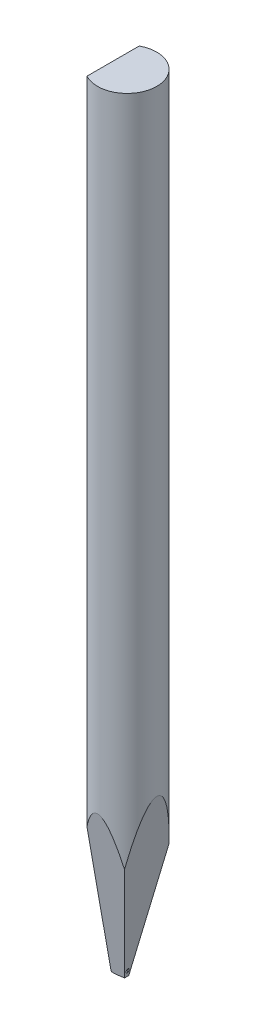
ISO-10303-21;
HEADER;
FILE_DESCRIPTION(('STEP AP214'),'2;1');
FILE_NAME('part.step','',(''),(''),'','','');
FILE_SCHEMA(('AUTOMOTIVE_DESIGN { 1 0 10303 214 1 1 1 1 }'));
ENDSEC;
DATA;
#1=APPLICATION_CONTEXT('core data for automotive mechanical design processes');
#2=APPLICATION_PROTOCOL_DEFINITION('international standard','automotive_design',2000,#1);
#3=PRODUCT_CONTEXT('',#1,'mechanical');
#4=PRODUCT('Part','Part','',(#3));
#5=PRODUCT_RELATED_PRODUCT_CATEGORY('part','',(#4));
#6=PRODUCT_DEFINITION_FORMATION('','',#4);
#7=PRODUCT_DEFINITION_CONTEXT('part definition',#1,'design');
#8=PRODUCT_DEFINITION('design','',#6,#7);
#9=PRODUCT_DEFINITION_SHAPE('','',#8);
#10=(LENGTH_UNIT() NAMED_UNIT(*) SI_UNIT(.MILLI.,.METRE.));
#11=(NAMED_UNIT(*) PLANE_ANGLE_UNIT() SI_UNIT($,.RADIAN.));
#12=(NAMED_UNIT(*) SI_UNIT($,.STERADIAN.) SOLID_ANGLE_UNIT());
#13=UNCERTAINTY_MEASURE_WITH_UNIT(LENGTH_MEASURE(1.E-05),#10,'distance_accuracy_value','');
#14=(GEOMETRIC_REPRESENTATION_CONTEXT(3) GLOBAL_UNCERTAINTY_ASSIGNED_CONTEXT((#13)) GLOBAL_UNIT_ASSIGNED_CONTEXT((#10,
#11,#12)) REPRESENTATION_CONTEXT('',''));
#15=CARTESIAN_POINT('',(0.,0.,0.));
#16=DIRECTION('',(0.,0.,1.));
#17=DIRECTION('',(1.,0.,0.));
#18=AXIS2_PLACEMENT_3D('',#15,#16,#17);
#19=CARTESIAN_POINT('',(26.8738719491216,0.,0.0508));
#20=DIRECTION('',(0.,-0.173648177666931,0.984807753012208));
#21=DIRECTION('',(0.,-0.984807753012208,-0.173648177666931));
#22=AXIS2_PLACEMENT_3D('',#19,#20,#21);
#23=PLANE('',#22);
#24=CARTESIAN_POINT('',(-0.35052,0.0254,0.0552787053099968));
#25=DIRECTION('',(0.,-0.173648177666931,0.984807753012208));
#26=DIRECTION('',(0.,-0.984807753012208,-0.173648177666931));
#27=AXIS2_PLACEMENT_3D('',#24,#25,#26);
#28=ELLIPSE('',#27,0.0257918359418979,0.0254);
#29=CARTESIAN_POINT('',(-0.35052,0.,0.0508000000000018));
#30=VERTEX_POINT('',#29);
#31=CARTESIAN_POINT('',(-0.37592,0.0254,0.0552787053099968));
#32=VERTEX_POINT('',#31);
#33=EDGE_CURVE('E204',#30,#32,#28,.F.);
#34=ORIENTED_EDGE('',*,*,#33,.F.);
#35=DIRECTION('',(-1.,0.,0.));
#36=VECTOR('',#35,1.);
#37=CARTESIAN_POINT('',(26.8738719491216,0.,0.0508));
#38=LINE('',#37,#36);
#39=CARTESIAN_POINT('',(-0.261619999999994,0.,0.0508000000000001));
#40=VERTEX_POINT('',#39);
#41=EDGE_CURVE('E268',#40,#30,#38,.T.);
#42=ORIENTED_EDGE('',*,*,#41,.F.);
#43=DIRECTION('',(-0.98997002855162,-0.139131214142995,-0.0245325869121374));
#44=VECTOR('',#43,1.);
#45=CARTESIAN_POINT('',(26.332265369517,3.73752684781165,0.709826824391458));
#46=LINE('',#45,#44);
#47=CARTESIAN_POINT('',(-0.0141883616704936,0.0347742489826101,0.0569316383295083));
#48=VERTEX_POINT('',#47);
#49=EDGE_CURVE('E265',#48,#40,#46,.T.);
#50=ORIENTED_EDGE('',*,*,#49,.F.);
#51=DIRECTION('',(-0.171087869746036,-0.970287525247814,-0.171087869746036));
#52=VECTOR('',#51,1.);
#53=CARTESIAN_POINT('',(0.766901483986011,4.46455489014234,0.838021483986016));
#54=LINE('',#53,#52);
#55=CARTESIAN_POINT('',(0.523678555180163,3.08516911589156,0.594798555180167));
#56=VERTEX_POINT('',#55);
#57=EDGE_CURVE('E262',#56,#48,#54,.T.);
#58=ORIENTED_EDGE('',*,*,#57,.F.);
#59=CARTESIAN_POINT('',(0.,-0.288101116436578,0.));
#60=DIRECTION('',(0.,-0.173648177666931,0.984807753012208));
#61=DIRECTION('',(0.,-0.984807753012208,-0.173648177666931));
#62=AXIS2_PLACEMENT_3D('',#59,#60,#61);
#63=ELLIPSE('',#62,4.56371043248163,0.792479999999998);
#64=CARTESIAN_POINT('',(-0.37592,3.66844093071415,0.69764511322018));
#65=VERTEX_POINT('',#64);
#66=EDGE_CURVE('E273',#56,#65,#63,.T.);
#67=ORIENTED_EDGE('',*,*,#66,.T.);
#68=DIRECTION('',(0.,0.984807753012208,0.173648177666931));
#69=VECTOR('',#68,1.);
#70=CARTESIAN_POINT('',(-0.37592,20.251112252608,3.62161747949059));
#71=LINE('',#70,#69);
#72=EDGE_CURVE('E287',#32,#65,#71,.T.);
#73=ORIENTED_EDGE('',*,*,#72,.F.);
#74=EDGE_LOOP('',(#34,#42,#50,#58,#67,#73));
#75=FACE_BOUND('',#74,.T.);
#76=ADVANCED_FACE('F46',(#75),#23,.T.);
#77=CARTESIAN_POINT('',(26.8738719491216,0.,-0.0508));
#78=DIRECTION('',(0.,-0.173648177666931,-0.984807753012208));
#79=DIRECTION('',(0.,0.984807753012208,-0.173648177666931));
#80=AXIS2_PLACEMENT_3D('',#77,#78,#79);
#81=PLANE('',#80);
#82=CARTESIAN_POINT('',(-0.35052,0.0254,-0.0552787053099968));
#83=DIRECTION('',(0.,-0.173648177666931,-0.984807753012208));
#84=DIRECTION('',(0.,0.984807753012208,-0.173648177666931));
#85=AXIS2_PLACEMENT_3D('',#82,#83,#84);
#86=ELLIPSE('',#85,0.0257918359418979,0.0254);
#87=CARTESIAN_POINT('',(-0.37592,0.0254,-0.0552787053099968));
#88=VERTEX_POINT('',#87);
#89=CARTESIAN_POINT('',(-0.35052,0.,-0.0508000000000018));
#90=VERTEX_POINT('',#89);
#91=EDGE_CURVE('E201',#88,#90,#86,.F.);
#92=ORIENTED_EDGE('',*,*,#91,.F.);
#93=DIRECTION('',(0.,-0.984807753012208,0.173648177666931));
#94=VECTOR('',#93,1.);
#95=CARTESIAN_POINT('',(-0.37592,20.5255765703836,-3.67001294395617));
#96=LINE('',#95,#94);
#97=CARTESIAN_POINT('',(-0.37592,3.66844093071414,-0.69764511322018));
#98=VERTEX_POINT('',#97);
#99=EDGE_CURVE('E193',#98,#88,#96,.T.);
#100=ORIENTED_EDGE('',*,*,#99,.F.);
#101=CARTESIAN_POINT('',(0.,-0.288101116436578,0.));
#102=DIRECTION('',(0.,-0.173648177666931,-0.984807753012208));
#103=DIRECTION('',(0.,-0.984807753012208,0.173648177666931));
#104=AXIS2_PLACEMENT_3D('',#101,#102,#103);
#105=ELLIPSE('',#104,4.56371043248163,0.792479999999998);
#106=CARTESIAN_POINT('',(0.523678555180163,3.08516911589156,-0.594798555180167));
#107=VERTEX_POINT('',#106);
#108=EDGE_CURVE('E276',#98,#107,#105,.T.);
#109=ORIENTED_EDGE('',*,*,#108,.T.);
#110=DIRECTION('',(0.171087869746036,0.970287525247814,-0.171087869746036));
#111=VECTOR('',#110,1.);
#112=CARTESIAN_POINT('',(0.766901483986011,4.46455489014234,-0.838021483986016));
#113=LINE('',#112,#111);
#114=CARTESIAN_POINT('',(-0.0141883616704936,0.0347742489826101,-0.0569316383295083));
#115=VERTEX_POINT('',#114);
#116=EDGE_CURVE('E290',#115,#107,#113,.T.);
#117=ORIENTED_EDGE('',*,*,#116,.F.);
#118=DIRECTION('',(0.98997002855162,0.139131214142995,-0.0245325869121374));
#119=VECTOR('',#118,1.);
#120=CARTESIAN_POINT('',(26.332265369517,3.73752684781165,-0.709826824391458));
#121=LINE('',#120,#119);
#122=CARTESIAN_POINT('',(-0.261619999999994,0.,-0.0508000000000001));
#123=VERTEX_POINT('',#122);
#124=EDGE_CURVE('E293',#123,#115,#121,.T.);
#125=ORIENTED_EDGE('',*,*,#124,.F.);
#126=DIRECTION('',(-1.,0.,0.));
#127=VECTOR('',#126,1.);
#128=CARTESIAN_POINT('',(26.8738719491216,0.,-0.0508));
#129=LINE('',#128,#127);
#130=EDGE_CURVE('E270',#123,#90,#129,.T.);
#131=ORIENTED_EDGE('',*,*,#130,.T.);
#132=EDGE_LOOP('',(#92,#100,#109,#117,#125,#131));
#133=FACE_BOUND('',#132,.T.);
#134=ADVANCED_FACE('F382',(#133),#81,.T.);
#135=CARTESIAN_POINT('',(-0.26162,0.,27.2760283406468));
#136=DIRECTION('',(-0.139173100960066,0.99026806874157,0.));
#137=DIRECTION('',(-0.99026806874157,-0.139173100960066,0.));
#138=AXIS2_PLACEMENT_3D('',#135,#136,#137);
#139=PLANE('',#138);
#140=DIRECTION('',(-0.99026806874157,-0.139173100960066,0.));
#141=VECTOR('',#140,1.);
#142=CARTESIAN_POINT('',(-0.26162,0.,0.0266699999999995));
#143=LINE('',#142,#141);
#144=CARTESIAN_POINT('',(-0.14478,0.0164207911266275,0.0266699999999997));
#145=VERTEX_POINT('',#144);
#146=CARTESIAN_POINT('',(-0.242759688637711,0.00265064390160265,0.02667));
#147=VERTEX_POINT('',#146);
#148=EDGE_CURVE('E248',#145,#147,#143,.T.);
#149=ORIENTED_EDGE('',*,*,#148,.F.);
#150=DIRECTION('',(0.,0.,1.));
#151=VECTOR('',#150,1.);
#152=CARTESIAN_POINT('',(-0.14478,0.0164207911266275,27.2760283406468));
#153=LINE('',#152,#151);
#154=CARTESIAN_POINT('',(-0.14478,0.0164207911266275,-0.0266699999999997));
#155=VERTEX_POINT('',#154);
#156=EDGE_CURVE('E304',#155,#145,#153,.T.);
#157=ORIENTED_EDGE('',*,*,#156,.F.);
#158=DIRECTION('',(-0.99026806874157,-0.139173100960066,0.));
#159=VECTOR('',#158,1.);
#160=CARTESIAN_POINT('',(-0.26162,0.,-0.0266699999999995));
#161=LINE('',#160,#159);
#162=CARTESIAN_POINT('',(-0.242759688637711,0.00265064390160265,-0.02667));
#163=VERTEX_POINT('',#162);
#164=EDGE_CURVE('E244',#155,#163,#161,.T.);
#165=ORIENTED_EDGE('',*,*,#164,.T.);
#166=CARTESIAN_POINT('',(-2.42134817183527,-0.30353,0.));
#167=DIRECTION('',(-0.139173100960066,0.99026806874157,0.));
#168=DIRECTION('',(-0.99026806874157,-0.139173100960066,0.));
#169=AXIS2_PLACEMENT_3D('',#166,#167,#168);
#170=ELLIPSE('',#169,2.20832903686027,0.30734);
#171=CARTESIAN_POINT('',(-0.26162,0.,-0.0482432865795794));
#172=VERTEX_POINT('',#171);
#173=EDGE_CURVE('E296',#163,#172,#170,.T.);
#174=ORIENTED_EDGE('',*,*,#173,.T.);
#175=DIRECTION('',(0.,0.,-1.));
#176=VECTOR('',#175,1.);
#177=CARTESIAN_POINT('',(-0.26162,0.,27.2760283406468));
#178=LINE('',#177,#176);
#179=EDGE_CURVE('E254',#172,#123,#178,.T.);
#180=ORIENTED_EDGE('',*,*,#179,.T.);
#181=ORIENTED_EDGE('',*,*,#124,.T.);
#182=DIRECTION('',(0.,0.,-1.));
#183=VECTOR('',#182,1.);
#184=CARTESIAN_POINT('',(-0.0141883616704921,0.0347742489826094,27.2760283406468));
#185=LINE('',#184,#183);
#186=EDGE_CURVE('E251',#48,#115,#185,.T.);
#187=ORIENTED_EDGE('',*,*,#186,.F.);
#188=ORIENTED_EDGE('',*,*,#49,.T.);
#189=CARTESIAN_POINT('',(-0.261619999999997,0.,0.0482432865795852));
#190=VERTEX_POINT('',#189);
#191=EDGE_CURVE('E256',#40,#190,#178,.T.);
#192=ORIENTED_EDGE('',*,*,#191,.T.);
#193=EDGE_CURVE('E297',#190,#147,#170,.T.);
#194=ORIENTED_EDGE('',*,*,#193,.T.);
#195=EDGE_LOOP('',(#149,#157,#165,#174,#180,#181,#187,#188,#192,#194));
#196=FACE_BOUND('',#195,.T.);
#197=ADVANCED_FACE('F329',(#196),#139,.F.);
#198=CARTESIAN_POINT('',(26.7309969491216,-0.30353,0.));
#199=DIRECTION('',(-1.,0.,0.));
#200=DIRECTION('',(0.,0.,1.));
#201=AXIS2_PLACEMENT_3D('',#198,#199,#200);
#202=CYLINDRICAL_SURFACE('',#201,0.30734);
#203=DIRECTION('',(-1.,0.,0.));
#204=VECTOR('',#203,1.);
#205=CARTESIAN_POINT('',(26.7309969491216,0.,0.0482432865795852));
#206=LINE('',#205,#204);
#207=CARTESIAN_POINT('',(-0.35052,0.,0.0482432865795858));
#208=VERTEX_POINT('',#207);
#209=EDGE_CURVE('E303',#190,#208,#206,.T.);
#210=ORIENTED_EDGE('',*,*,#209,.T.);
#211=CARTESIAN_POINT('',(-0.35052,0.,0.0482432865795852));
#212=CARTESIAN_POINT('',(-0.350767913301096,-1.19542843772803E-07,0.0482439866555444));
#213=CARTESIAN_POINT('',(-0.351014861392933,3.62470794984307E-06,0.0482204837583812));
#214=CARTESIAN_POINT('',(-0.351497824475882,1.77257610530701E-05,0.048131663550789));
#215=CARTESIAN_POINT('',(-0.351733938449228,2.79980345508259E-05,0.0480668807295799));
#216=CARTESIAN_POINT('',(-0.352256326088675,5.77005969758154E-05,0.0478789541586123));
#217=CARTESIAN_POINT('',(-0.352538394385228,7.88787351782238E-05,0.0477446199469163));
#218=CARTESIAN_POINT('',(-0.353078295346921,0.000127703558985932,0.0474331108524059));
#219=CARTESIAN_POINT('',(-0.353335984553503,0.000155385552449527,0.0472557019452807));
#220=CARTESIAN_POINT('',(-0.35400174233734,0.00023617459435752,0.0467343071530912));
#221=CARTESIAN_POINT('',(-0.354386489991853,0.000293366747035686,0.04636155839518));
#222=CARTESIAN_POINT('',(-0.355098951579075,0.000413574680164901,0.0455669319559007));
#223=CARTESIAN_POINT('',(-0.355426537167256,0.000476603091413842,0.0451449471799639));
#224=CARTESIAN_POINT('',(-0.356612086855196,0.000724574718518854,0.0434579803018295));
#225=CARTESIAN_POINT('',(-0.357318341338528,0.000917424822642028,0.0420900984298448));
#226=CARTESIAN_POINT('',(-0.358546499103955,0.00129385703696121,0.0392733364497388));
#227=CARTESIAN_POINT('',(-0.359067131306756,0.0014773681362723,0.0378239736931028));
#228=CARTESIAN_POINT('',(-0.361082963556255,0.00223677886764504,0.0314441024489423));
#229=CARTESIAN_POINT('',(-0.361998491462294,0.00272303861932352,0.0263250556700738));
#230=CARTESIAN_POINT('',(-0.363287466260708,0.00343648568054079,0.0160225561821279));
#231=CARTESIAN_POINT('',(-0.363659578270333,0.0036630347273081,0.0108389763129056));
#232=CARTESIAN_POINT('',(-0.363972985043323,0.00385330138614358,0.000449493392470492));
#233=CARTESIAN_POINT('',(-0.363914353724792,0.00381706409391508,-0.00475640567539981));
#234=CARTESIAN_POINT('',(-0.363359645903479,0.00348101396992523,-0.0151346555748545));
#235=CARTESIAN_POINT('',(-0.362863906204434,0.00318140407436096,-0.0203070291482792));
#236=CARTESIAN_POINT('',(-0.361587863461915,0.00253284401461739,-0.0281196828661227));
#237=CARTESIAN_POINT('',(-0.361052170464876,0.0022738659867185,-0.0308032472057407));
#238=CARTESIAN_POINT('',(-0.359879874536839,0.00178202258087802,-0.0352985409759539));
#239=CARTESIAN_POINT('',(-0.359320212463211,0.00156415994286779,-0.0371329765625637));
#240=CARTESIAN_POINT('',(-0.357915449615104,0.00108653420359569,-0.0408693960879428));
#241=CARTESIAN_POINT('',(-0.3570519058511,0.000824845821217691,-0.0427659366927652));
#242=CARTESIAN_POINT('',(-0.355666955135482,0.000526022910364276,-0.0448100132221557));
#243=CARTESIAN_POINT('',(-0.355427139387419,0.000477218188454204,-0.0451397061499097));
#244=CARTESIAN_POINT('',(-0.354916645564511,0.00038202095342617,-0.0457761949331125));
#245=CARTESIAN_POINT('',(-0.354645904201855,0.000335633680386315,-0.046082941629228));
#246=CARTESIAN_POINT('',(-0.354064289185953,0.000246758191854156,-0.046665244521223));
#247=CARTESIAN_POINT('',(-0.353752942125983,0.000204328109509145,-0.0469403464238046));
#248=CARTESIAN_POINT('',(-0.353086480397482,0.000127793869631165,-0.0474329155161114));
#249=CARTESIAN_POINT('',(-0.352731561443898,9.36543940562352E-05,-0.0476506275388426));
#250=CARTESIAN_POINT('',(-0.352132978988963,5.02841505678784E-05,-0.0479259603811109));
#251=CARTESIAN_POINT('',(-0.351903112512649,3.65754200289388E-05,-0.0480126464944021));
#252=CARTESIAN_POINT('',(-0.351432234922708,1.53075235908591E-05,-0.0481469291864184));
#253=CARTESIAN_POINT('',(-0.351191258260106,7.73054276230474E-06,-0.0481946390090931));
#254=CARTESIAN_POINT('',(-0.350805892270728,1.19685939597785E-06,-0.0482357533750439));
#255=CARTESIAN_POINT('',(-0.350662956582406,-3.31045745205668E-08,-0.0482434827775498));
#256=CARTESIAN_POINT('',(-0.35052,0.,-0.0482432865795856));
#257=B_SPLINE_CURVE_WITH_KNOTS('',3,(#211,#212,#213,#214,#215,#216,#217,#218,#219,#220,#221,
#222,#223,#224,#225,#226,#227,#228,#229,#230,#231,#232,#233,#234,#235,#236,#237,#238,#239,#240,
#241,#242,#243,#244,#245,#246,#247,#248,#249,#250,#251,#252,#253,#254,#255,#256),.UNSPECIFIED.,
.F.,.F.,(4,2,2,2,2,2,2,2,2,2,2,2,2,2,2,2,2,2,2,2,2,2,4),(0.,0.000741043318305486,
0.00147268140779397,0.00240682725086805,0.00334616655924916,0.00495326023235424,
0.00656391709747215,0.0111818210055972,0.0158307654682357,0.0313880221471822,0.0469834307890158,
0.0625761632290354,0.0781568915394422,0.0863865542979192,0.0921775559520869,0.0984081610414817,
0.0996385359491797,0.100871475463076,0.102120347956776,0.103363803055068,0.104099176293444,
0.104832405260387,0.105261095012052),.UNSPECIFIED.);
#258=CARTESIAN_POINT('',(-0.361394986445845,0.00245148621527582,0.028861259944239));
#259=VERTEX_POINT('',#258);
#260=EDGE_CURVE('E202',#208,#259,#257,.T.);
#261=ORIENTED_EDGE('',*,*,#260,.T.);
#262=CARTESIAN_POINT('',(-0.37592,0.,-0.0482432865795854));
#263=CARTESIAN_POINT('',(-0.363217772431748,0.00253447256157342,-0.0322972656685655));
#264=CARTESIAN_POINT('',(-0.35052,0.00380999999999999,-0.0161478491107738));
#265=CARTESIAN_POINT('',(-0.35052,0.00380999999999997,0.0161478491107741));
#266=CARTESIAN_POINT('',(-0.363217772431748,0.00253447256157349,0.0322972656685651));
#267=CARTESIAN_POINT('',(-0.37592,0.,0.0482432865795852));
#268=(BOUNDED_CURVE() B_SPLINE_CURVE(3,(#262,#263,#264,#265,#266,#267),.UNSPECIFIED.,.F.,
.F.) B_SPLINE_CURVE_WITH_KNOTS((4,2,4),(1.41317404265068,1.5707963267949,1.72841861093912),
.UNSPECIFIED.) CURVE() GEOMETRIC_REPRESENTATION_ITEM() RATIONAL_B_SPLINE_CURVE((1.,1.,1.,1.,1.,1.)) REPRESENTATION_ITEM(''));
#269=CARTESIAN_POINT('',(-0.36139493561956,0.00245148328491575,-0.0288612910505755));
#270=VERTEX_POINT('',#269);
#271=EDGE_CURVE('E185',#259,#270,#268,.F.);
#272=ORIENTED_EDGE('',*,*,#271,.T.);
#273=CARTESIAN_POINT('',(-0.35052,0.,-0.0482432865795858));
#274=VERTEX_POINT('',#273);
#275=EDGE_CURVE('E79',#270,#274,#257,.T.);
#276=ORIENTED_EDGE('',*,*,#275,.T.);
#277=DIRECTION('',(-1.,0.,0.));
#278=VECTOR('',#277,1.);
#279=CARTESIAN_POINT('',(26.7309969491216,0.,-0.0482432865795852));
#280=LINE('',#279,#278);
#281=EDGE_CURVE('E255',#172,#274,#280,.T.);
#282=ORIENTED_EDGE('',*,*,#281,.F.);
#283=ORIENTED_EDGE('',*,*,#173,.F.);
#284=DIRECTION('',(-1.,0.,0.));
#285=VECTOR('',#284,1.);
#286=CARTESIAN_POINT('',(26.7309969491216,0.00265064390160265,-0.02667));
#287=LINE('',#286,#285);
#288=CARTESIAN_POINT('',(-0.271948138549541,0.00265064390160211,-0.02667));
#289=VERTEX_POINT('',#288);
#290=EDGE_CURVE('E300',#163,#289,#287,.T.);
#291=ORIENTED_EDGE('',*,*,#290,.T.);
#292=CARTESIAN_POINT('',(-0.271948138551085,0.0026506439016026,0.02667));
#293=CARTESIAN_POINT('',(-0.279741629783165,0.00204900725860289,0.033576992678982));
#294=CARTESIAN_POINT('',(-0.291389606178554,0.00193660172033543,0.034257483360682));
#295=CARTESIAN_POINT('',(-0.311487532290503,0.00289784041037014,0.0241950109364427));
#296=CARTESIAN_POINT('',(-0.319710546582025,0.00381613135063559,0.0123603930079638));
#297=CARTESIAN_POINT('',(-0.319620360481282,0.003803793942765,-0.012663446302628));
#298=CARTESIAN_POINT('',(-0.311402735354475,0.00288674413616352,-0.0243323793322763));
#299=CARTESIAN_POINT('',(-0.291204635526973,0.0019239672897776,-0.0343680031120969));
#300=CARTESIAN_POINT('',(-0.279697672011876,0.00205131867932823,-0.0335504567852432));
#301=CARTESIAN_POINT('',(-0.271948138549539,0.00265064390160259,-0.02667));
#302=(BOUNDED_CURVE() B_SPLINE_CURVE(3,(#292,#293,#294,#295,#296,#297,#298,#299,#300,#301),
.UNSPECIFIED.,.F.,.F.) B_SPLINE_CURVE_WITH_KNOTS((4,2,2,2,4),(0.,2.31400024965948E-05,
4.62800049931879E-05,6.9420007489781E-05,9.25600099863741E-05),
.UNSPECIFIED.) CURVE() GEOMETRIC_REPRESENTATION_ITEM() RATIONAL_B_SPLINE_CURVE((1.,1.,1.,1.,1.,
1.,1.,1.,1.,1.)) REPRESENTATION_ITEM(''));
#303=CARTESIAN_POINT('',(-0.271948138549541,0.00265064390160196,0.02667));
#304=VERTEX_POINT('',#303);
#305=EDGE_CURVE('E306',#289,#304,#302,.F.);
#306=ORIENTED_EDGE('',*,*,#305,.T.);
#307=DIRECTION('',(-1.,0.,0.));
#308=VECTOR('',#307,1.);
#309=CARTESIAN_POINT('',(26.7309969491216,0.00265064390160265,0.02667));
#310=LINE('',#309,#308);
#311=EDGE_CURVE('E307',#147,#304,#310,.T.);
#312=ORIENTED_EDGE('',*,*,#311,.F.);
#313=ORIENTED_EDGE('',*,*,#193,.F.);
#314=EDGE_LOOP('',(#210,#261,#272,#276,#282,#283,#291,#306,#312,#313));
#315=FACE_BOUND('',#314,.T.);
#316=ADVANCED_FACE('F318',(#315),#202,.F.);
#317=CARTESIAN_POINT('',(0.,0.,0.));
#318=DIRECTION('',(0.,1.,0.));
#319=DIRECTION('',(0.,0.,1.));
#320=AXIS2_PLACEMENT_3D('',#317,#318,#319);
#321=PLANE('',#320);
#322=ORIENTED_EDGE('',*,*,#41,.T.);
#323=DIRECTION('',(0.,0.,-1.));
#324=VECTOR('',#323,1.);
#325=CARTESIAN_POINT('',(-0.35052,0.,26.4440181042188));
#326=LINE('',#325,#324);
#327=EDGE_CURVE('E71',#30,#208,#326,.T.);
#328=ORIENTED_EDGE('',*,*,#327,.T.);
#329=ORIENTED_EDGE('',*,*,#209,.F.);
#330=ORIENTED_EDGE('',*,*,#191,.F.);
#331=EDGE_LOOP('',(#322,#328,#329,#330));
#332=FACE_BOUND('',#331,.T.);
#333=ADVANCED_FACE('F328',(#332),#321,.F.);
#334=ORIENTED_EDGE('',*,*,#281,.T.);
#335=EDGE_CURVE('E200',#274,#90,#326,.T.);
#336=ORIENTED_EDGE('',*,*,#335,.T.);
#337=ORIENTED_EDGE('',*,*,#130,.F.);
#338=ORIENTED_EDGE('',*,*,#179,.F.);
#339=EDGE_LOOP('',(#334,#336,#337,#338));
#340=FACE_BOUND('',#339,.T.);
#341=ADVANCED_FACE('F387',(#340),#321,.F.);
#342=CARTESIAN_POINT('',(0.,21.0312,0.));
#343=DIRECTION('',(0.,-1.,0.));
#344=DIRECTION('',(0.,0.,-1.));
#345=AXIS2_PLACEMENT_3D('',#342,#343,#344);
#346=CYLINDRICAL_SURFACE('',#345,0.792479999999998);
#347=ORIENTED_EDGE('',*,*,#66,.F.);
#348=CARTESIAN_POINT('',(0.,0.115240446574634,0.));
#349=DIRECTION('',(-0.984807753012208,0.173648177666931,0.));
#350=DIRECTION('',(-0.173648177666931,-0.984807753012208,0.));
#351=AXIS2_PLACEMENT_3D('',#348,#349,#350);
#352=ELLIPSE('',#351,4.56371043248165,0.792479999999998);
#353=EDGE_CURVE('E259',#56,#107,#352,.T.);
#354=ORIENTED_EDGE('',*,*,#353,.T.);
#355=ORIENTED_EDGE('',*,*,#108,.F.);
#356=DIRECTION('',(0.,-1.,0.));
#357=VECTOR('',#356,1.);
#358=CARTESIAN_POINT('',(-0.37592,21.0312,-0.69764511322018));
#359=LINE('',#358,#357);
#360=CARTESIAN_POINT('',(-0.37592,21.0312,-0.69764511322018));
#361=VERTEX_POINT('',#360);
#362=EDGE_CURVE('E282',#361,#98,#359,.T.);
#363=ORIENTED_EDGE('',*,*,#362,.F.);
#364=CARTESIAN_POINT('',(0.,21.0312,0.));
#365=DIRECTION('',(0.,1.,0.));
#366=DIRECTION('',(0.,0.,1.));
#367=AXIS2_PLACEMENT_3D('',#364,#365,#366);
#368=CIRCLE('',#367,0.792479999999998);
#369=CARTESIAN_POINT('',(-0.37592,21.0312,0.69764511322018));
#370=VERTEX_POINT('',#369);
#371=EDGE_CURVE('E284',#370,#361,#368,.T.);
#372=ORIENTED_EDGE('',*,*,#371,.F.);
#373=DIRECTION('',(0.,-1.,0.));
#374=VECTOR('',#373,1.);
#375=CARTESIAN_POINT('',(-0.37592,21.0312,0.69764511322018));
#376=LINE('',#375,#374);
#377=EDGE_CURVE('E280',#65,#370,#376,.F.);
#378=ORIENTED_EDGE('',*,*,#377,.F.);
#379=EDGE_LOOP('',(#347,#354,#355,#363,#372,#378));
#380=FACE_BOUND('',#379,.T.);
#381=ADVANCED_FACE('F381',(#380),#346,.T.);
#382=CARTESIAN_POINT('',(-0.37592,21.0312,-0.80247998));
#383=DIRECTION('',(-1.,0.,0.));
#384=DIRECTION('',(0.,0.,1.));
#385=AXIS2_PLACEMENT_3D('',#382,#383,#384);
#386=PLANE('',#385);
#387=DIRECTION('',(0.,0.,-1.));
#388=VECTOR('',#387,1.);
#389=CARTESIAN_POINT('',(-0.37592,0.0254,26.4440181042188));
#390=LINE('',#389,#388);
#391=CARTESIAN_POINT('',(-0.37592,0.0253965728299479,0.0162828578856257));
#392=VERTEX_POINT('',#391);
#393=EDGE_CURVE('E196',#32,#392,#390,.T.);
#394=ORIENTED_EDGE('',*,*,#393,.F.);
#395=ORIENTED_EDGE('',*,*,#72,.T.);
#396=ORIENTED_EDGE('',*,*,#377,.T.);
#397=DIRECTION('',(0.,0.,-1.));
#398=VECTOR('',#397,1.);
#399=CARTESIAN_POINT('',(-0.37592,21.0312,-0.80247998));
#400=LINE('',#399,#398);
#401=EDGE_CURVE('E278',#370,#361,#400,.T.);
#402=ORIENTED_EDGE('',*,*,#401,.T.);
#403=ORIENTED_EDGE('',*,*,#362,.T.);
#404=ORIENTED_EDGE('',*,*,#99,.T.);
#405=CARTESIAN_POINT('',(-0.37592,0.0254,-0.0160570095759892));
#406=VERTEX_POINT('',#405);
#407=EDGE_CURVE('E190',#406,#88,#390,.T.);
#408=ORIENTED_EDGE('',*,*,#407,.F.);
#409=CARTESIAN_POINT('',(-0.37592,0.,0.0482432865795852));
#410=CARTESIAN_POINT('',(-0.37592,0.0149574693246277,0.0344039161936227));
#411=CARTESIAN_POINT('',(-0.37592,0.0292099999999983,0.0174815349681417));
#412=CARTESIAN_POINT('',(-0.37592,0.0292099999999983,-0.0174815349681413));
#413=CARTESIAN_POINT('',(-0.37592,0.0149574693246281,-0.0344039161936234));
#414=CARTESIAN_POINT('',(-0.37592,0.,-0.0482432865795854));
#415=(BOUNDED_CURVE() B_SPLINE_CURVE(3,(#409,#410,#411,#412,#413,#414),.UNSPECIFIED.,.F.,
.F.) B_SPLINE_CURVE_WITH_KNOTS((4,2,4),(1.41317404265068,1.5707963267949,1.72841861093912),
.UNSPECIFIED.) CURVE() GEOMETRIC_REPRESENTATION_ITEM() RATIONAL_B_SPLINE_CURVE((1.,1.,1.,1.,1.,1.)) REPRESENTATION_ITEM(''));
#416=EDGE_CURVE('E178',#406,#392,#415,.F.);
#417=ORIENTED_EDGE('',*,*,#416,.T.);
#418=EDGE_LOOP('',(#394,#395,#396,#402,#403,#404,#408,#417));
#419=FACE_BOUND('',#418,.T.);
#420=ADVANCED_FACE('F191',(#419),#386,.T.);
#421=CARTESIAN_POINT('',(0.,21.0312,0.));
#422=DIRECTION('',(0.,1.,0.));
#423=DIRECTION('',(0.,0.,1.));
#424=AXIS2_PLACEMENT_3D('',#421,#422,#423);
#425=PLANE('',#424);
#426=ORIENTED_EDGE('',*,*,#371,.T.);
#427=ORIENTED_EDGE('',*,*,#401,.F.);
#428=EDGE_LOOP('',(#426,#427));
#429=FACE_BOUND('',#428,.T.);
#430=ADVANCED_FACE('F380',(#429),#425,.T.);
#431=CARTESIAN_POINT('',(-0.0141883616704921,0.0347742489826094,27.2760283406468));
#432=DIRECTION('',(-0.984807753012208,0.173648177666931,0.));
#433=DIRECTION('',(-0.173648177666931,-0.984807753012208,0.));
#434=AXIS2_PLACEMENT_3D('',#431,#432,#433);
#435=PLANE('',#434);
#436=CARTESIAN_POINT('',(0.0121647761412605,0.184230320344282,0.));
#437=DIRECTION('',(-0.984807753012208,0.173648177666931,0.));
#438=DIRECTION('',(0.173648177666931,0.984807753012208,0.));
#439=AXIS2_PLACEMENT_3D('',#436,#437,#438);
#440=ELLIPSE('',#439,0.0566555398592854,0.04069486264531);
#441=CARTESIAN_POINT('',(0.0220029073925616,0.240025135248798,0.));
#442=VERTEX_POINT('',#441);
#443=EDGE_CURVE('E250',#442,#442,#440,.F.);
#444=ORIENTED_EDGE('',*,*,#443,.F.);
#445=EDGE_LOOP('',(#444));
#446=FACE_BOUND('',#445,.T.);
#447=ORIENTED_EDGE('',*,*,#353,.F.);
#448=ORIENTED_EDGE('',*,*,#57,.T.);
#449=ORIENTED_EDGE('',*,*,#186,.T.);
#450=ORIENTED_EDGE('',*,*,#116,.T.);
#451=EDGE_LOOP('',(#447,#448,#449,#450));
#452=FACE_BOUND('',#451,.T.);
#453=ADVANCED_FACE('F334',(#446,#452),#435,.F.);
#454=CARTESIAN_POINT('',(-0.14478,0.0762000000000001,0.02667));
#455=DIRECTION('',(-1.,0.,0.));
#456=DIRECTION('',(0.,0.,1.));
#457=AXIS2_PLACEMENT_3D('',#454,#455,#456);
#458=PLANE('',#457);
#459=ORIENTED_EDGE('',*,*,#156,.T.);
#460=DIRECTION('',(0.,1.,0.));
#461=VECTOR('',#460,1.);
#462=CARTESIAN_POINT('',(-0.14478,0.0762000000000001,0.02667));
#463=LINE('',#462,#461);
#464=CARTESIAN_POINT('',(-0.14478,0.0762000000000001,0.02667));
#465=VERTEX_POINT('',#464);
#466=EDGE_CURVE('E231',#145,#465,#463,.T.);
#467=ORIENTED_EDGE('',*,*,#466,.T.);
#468=DIRECTION('',(0.,0.,-1.));
#469=VECTOR('',#468,1.);
#470=CARTESIAN_POINT('',(-0.14478,0.0762000000000001,0.02667));
#471=LINE('',#470,#469);
#472=CARTESIAN_POINT('',(-0.14478,0.0762000000000001,0.0254));
#473=VERTEX_POINT('',#472);
#474=EDGE_CURVE('E238',#465,#473,#471,.T.);
#475=ORIENTED_EDGE('',*,*,#474,.T.);
#476=CARTESIAN_POINT('',(-0.14478,0.0762000000000001,0.));
#477=DIRECTION('',(1.,0.,0.));
#478=DIRECTION('',(0.,1.,0.));
#479=AXIS2_PLACEMENT_3D('',#476,#477,#478);
#480=ELLIPSE('',#479,0.0293293936748329,0.0254);
#481=CARTESIAN_POINT('',(-0.14478,0.0762000000000001,-0.0253999999999983));
#482=VERTEX_POINT('',#481);
#483=EDGE_CURVE('E224',#482,#473,#480,.F.);
#484=ORIENTED_EDGE('',*,*,#483,.F.);
#485=CARTESIAN_POINT('',(-0.14478,0.0762000000000001,-0.02667));
#486=VERTEX_POINT('',#485);
#487=EDGE_CURVE('E234',#482,#486,#471,.T.);
#488=ORIENTED_EDGE('',*,*,#487,.T.);
#489=DIRECTION('',(0.,1.,0.));
#490=VECTOR('',#489,1.);
#491=CARTESIAN_POINT('',(-0.14478,0.0762000000000001,-0.02667));
#492=LINE('',#491,#490);
#493=EDGE_CURVE('E232',#155,#486,#492,.T.);
#494=ORIENTED_EDGE('',*,*,#493,.F.);
#495=EDGE_LOOP('',(#459,#467,#475,#484,#488,#494));
#496=FACE_BOUND('',#495,.T.);
#497=ADVANCED_FACE('F493',(#496),#458,.T.);
#498=CARTESIAN_POINT('',(-0.0179281649537089,0.149437941111173,0.));
#499=DIRECTION('',(0.866025403784441,0.499999999999995,0.));
#500=DIRECTION('',(-0.499999999999995,0.866025403784441,0.));
#501=AXIS2_PLACEMENT_3D('',#498,#499,#500);
#502=CONICAL_SURFACE('',#501,0.0254,0.392699081698725);
#503=CARTESIAN_POINT('',(-0.0179281649537089,0.149437941111173,0.));
#504=DIRECTION('',(0.866025403784441,0.499999999999995,0.));
#505=DIRECTION('',(-0.499999999999995,0.866025403784441,0.));
#506=AXIS2_PLACEMENT_3D('',#503,#504,#505);
#507=CIRCLE('',#506,0.0254);
#508=CARTESIAN_POINT('',(-0.0306281649537088,0.171434986367298,0.));
#509=VERTEX_POINT('',#508);
#510=EDGE_CURVE('E218',#509,#509,#507,.T.);
#511=ORIENTED_EDGE('',*,*,#510,.F.);
#512=EDGE_LOOP('',(#511));
#513=FACE_BOUND('',#512,.T.);
#514=ORIENTED_EDGE('',*,*,#443,.T.);
#515=EDGE_LOOP('',(#514));
#516=FACE_BOUND('',#515,.T.);
#517=ADVANCED_FACE('F498',(#513,#516),#502,.F.);
#518=CARTESIAN_POINT('',(-0.21652472337914,0.0762000000000001,0.));
#519=DIRECTION('',(-0.601815023152052,-0.79863551004729,0.));
#520=DIRECTION('',(0.79863551004729,-0.601815023152052,0.));
#521=AXIS2_PLACEMENT_3D('',#518,#519,#520);
#522=CYLINDRICAL_SURFACE('',#521,0.02667);
#523=DIRECTION('',(-0.601815023152052,-0.79863551004729,0.));
#524=VECTOR('',#523,1.);
#525=CARTESIAN_POINT('',(-0.174727583415436,0.131666678147377,0.02667));
#526=LINE('',#525,#524);
#527=CARTESIAN_POINT('',(-0.21652472337914,0.0762000000000001,0.02667));
#528=VERTEX_POINT('',#527);
#529=EDGE_CURVE('E241',#528,#304,#526,.T.);
#530=ORIENTED_EDGE('',*,*,#529,.T.);
#531=CARTESIAN_POINT('',(-0.271948138549539,0.00265064390160259,-0.02667));
#532=CARTESIAN_POINT('',(-0.279555270960462,0.00943805816144823,-0.0266700000000003));
#533=CARTESIAN_POINT('',(-0.284674543491638,0.0121424270676666,-0.0223594763620331));
#534=CARTESIAN_POINT('',(-0.292737360954689,0.0154005961716068,-0.0127540251388889));
#535=CARTESIAN_POINT('',(-0.295295129632121,0.0159528055988088,-0.00649764567299892));
#536=CARTESIAN_POINT('',(-0.295351163487313,0.0159406242705773,0.00634219519512988));
#537=CARTESIAN_POINT('',(-0.292789505622227,0.0153880805572035,0.0126791163867823));
#538=CARTESIAN_POINT('',(-0.284811098085695,0.01211920203898,0.0222861029267893));
#539=CARTESIAN_POINT('',(-0.279588088563957,0.00945438320073146,0.0266699999995283));
#540=CARTESIAN_POINT('',(-0.271948138551085,0.0026506439016026,0.02667));
#541=(BOUNDED_CURVE() B_SPLINE_CURVE(3,(#531,#532,#533,#534,#535,#536,#537,#538,#539,#540),
.UNSPECIFIED.,.F.,.F.) B_SPLINE_CURVE_WITH_KNOTS((4,2,2,2,4),(0.,2.31400024965948E-05,
4.62800049931879E-05,6.9420007489781E-05,9.25600099863741E-05),
.UNSPECIFIED.) CURVE() GEOMETRIC_REPRESENTATION_ITEM() RATIONAL_B_SPLINE_CURVE((1.,1.,1.,1.,1.,
1.,1.,1.,1.,1.)) REPRESENTATION_ITEM(''));
#542=EDGE_CURVE('E440',#304,#289,#541,.F.);
#543=ORIENTED_EDGE('',*,*,#542,.T.);
#544=DIRECTION('',(0.601815023152052,0.79863551004729,0.));
#545=VECTOR('',#544,1.);
#546=CARTESIAN_POINT('',(-0.21652472337914,0.0762000000000001,-0.02667));
#547=LINE('',#546,#545);
#548=CARTESIAN_POINT('',(-0.21652472337914,0.0762000000000001,-0.02667));
#549=VERTEX_POINT('',#548);
#550=EDGE_CURVE('E245',#289,#549,#547,.T.);
#551=ORIENTED_EDGE('',*,*,#550,.T.);
#552=CARTESIAN_POINT('',(-0.21652472337914,0.0762000000000001,0.));
#553=DIRECTION('',(0.,-1.,0.));
#554=DIRECTION('',(-1.,0.,0.));
#555=AXIS2_PLACEMENT_3D('',#552,#553,#554);
#556=ELLIPSE('',#555,0.0333944580030267,0.02667);
#557=EDGE_CURVE('E242',#549,#528,#556,.F.);
#558=ORIENTED_EDGE('',*,*,#557,.T.);
#559=EDGE_LOOP('',(#530,#543,#551,#558));
#560=FACE_BOUND('',#559,.T.);
#561=ADVANCED_FACE('F331',(#560),#522,.F.);
#562=CARTESIAN_POINT('',(0.,0.,0.02667));
#563=DIRECTION('',(0.,0.,-1.));
#564=DIRECTION('',(-1.,0.,0.));
#565=AXIS2_PLACEMENT_3D('',#562,#563,#564);
#566=PLANE('',#565);
#567=ORIENTED_EDGE('',*,*,#148,.T.);
#568=ORIENTED_EDGE('',*,*,#311,.T.);
#569=ORIENTED_EDGE('',*,*,#529,.F.);
#570=DIRECTION('',(-1.,0.,0.));
#571=VECTOR('',#570,1.);
#572=CARTESIAN_POINT('',(-0.249919181382167,0.0762000000000001,0.02667));
#573=LINE('',#572,#571);
#574=EDGE_CURVE('E228',#465,#528,#573,.T.);
#575=ORIENTED_EDGE('',*,*,#574,.F.);
#576=ORIENTED_EDGE('',*,*,#466,.F.);
#577=EDGE_LOOP('',(#567,#568,#569,#575,#576));
#578=FACE_BOUND('',#577,.T.);
#579=ADVANCED_FACE('F462',(#578),#566,.T.);
#580=CARTESIAN_POINT('',(0.,0.,-0.02667));
#581=DIRECTION('',(0.,0.,-1.));
#582=DIRECTION('',(-1.,0.,0.));
#583=AXIS2_PLACEMENT_3D('',#580,#581,#582);
#584=PLANE('',#583);
#585=ORIENTED_EDGE('',*,*,#493,.T.);
#586=DIRECTION('',(-1.,0.,0.));
#587=VECTOR('',#586,1.);
#588=CARTESIAN_POINT('',(-0.249919181382167,0.0762000000000001,-0.02667));
#589=LINE('',#588,#587);
#590=EDGE_CURVE('E227',#486,#549,#589,.T.);
#591=ORIENTED_EDGE('',*,*,#590,.T.);
#592=ORIENTED_EDGE('',*,*,#550,.F.);
#593=ORIENTED_EDGE('',*,*,#290,.F.);
#594=ORIENTED_EDGE('',*,*,#164,.F.);
#595=EDGE_LOOP('',(#585,#591,#592,#593,#594));
#596=FACE_BOUND('',#595,.T.);
#597=ADVANCED_FACE('F449',(#596),#584,.F.);
#598=CARTESIAN_POINT('',(-0.249919181382167,0.0762000000000001,0.02667));
#599=DIRECTION('',(0.,-1.,0.));
#600=DIRECTION('',(1.,0.,0.));
#601=AXIS2_PLACEMENT_3D('',#598,#599,#600);
#602=PLANE('',#601);
#603=ORIENTED_EDGE('',*,*,#590,.F.);
#604=ORIENTED_EDGE('',*,*,#487,.F.);
#605=CARTESIAN_POINT('',(-0.14478,0.0762000000000001,0.));
#606=DIRECTION('',(0.,1.,0.));
#607=DIRECTION('',(1.,0.,0.));
#608=AXIS2_PLACEMENT_3D('',#605,#606,#607);
#609=ELLIPSE('',#608,0.0508000000000005,0.0254);
#610=EDGE_CURVE('E221',#473,#482,#609,.F.);
#611=ORIENTED_EDGE('',*,*,#610,.F.);
#612=ORIENTED_EDGE('',*,*,#474,.F.);
#613=ORIENTED_EDGE('',*,*,#574,.T.);
#614=ORIENTED_EDGE('',*,*,#557,.F.);
#615=EDGE_LOOP('',(#603,#604,#611,#612,#613,#614));
#616=FACE_BOUND('',#615,.T.);
#617=ADVANCED_FACE('F600',(#616),#602,.T.);
#618=CARTESIAN_POINT('',(-0.37008783073679,-0.0538815367264148,0.));
#619=DIRECTION('',(0.866025403784441,0.499999999999995,0.));
#620=DIRECTION('',(-0.499999999999995,0.866025403784441,0.));
#621=AXIS2_PLACEMENT_3D('',#618,#619,#620);
#622=CYLINDRICAL_SURFACE('',#621,0.0254);
#623=ORIENTED_EDGE('',*,*,#483,.T.);
#624=ORIENTED_EDGE('',*,*,#610,.T.);
#625=EDGE_LOOP('',(#623,#624));
#626=FACE_BOUND('',#625,.T.);
#627=ORIENTED_EDGE('',*,*,#510,.T.);
#628=EDGE_LOOP('',(#627));
#629=FACE_BOUND('',#628,.T.);
#630=ADVANCED_FACE('F400',(#626,#629),#622,.F.);
#631=CARTESIAN_POINT('',(-0.271948138549539,0.00265064390160259,-0.02667));
#632=CARTESIAN_POINT('',(-0.279697672011876,0.00205131867932823,-0.0335504567852432));
#633=CARTESIAN_POINT('',(-0.291204635526973,0.0019239672897776,-0.0343680031120969));
#634=CARTESIAN_POINT('',(-0.311402735354475,0.00288674413616352,-0.0243323793322763));
#635=CARTESIAN_POINT('',(-0.319620360481282,0.003803793942765,-0.012663446302628));
#636=CARTESIAN_POINT('',(-0.319710546582025,0.00381613135063559,0.0123603930079638));
#637=CARTESIAN_POINT('',(-0.311487532290503,0.00289784041037014,0.0241950109364427));
#638=CARTESIAN_POINT('',(-0.291389606178554,0.00193660172033543,0.034257483360682));
#639=CARTESIAN_POINT('',(-0.279741629783165,0.00204900725860289,0.033576992678982));
#640=CARTESIAN_POINT('',(-0.271948138551085,0.0026506439016026,0.02667));
#641=CARTESIAN_POINT('',(-0.271948138549539,0.00265064390160259,-0.02667));
#642=CARTESIAN_POINT('',(-0.278532980679813,0.00265156650398631,-0.0266713667195468));
#643=CARTESIAN_POINT('',(-0.286376151576587,0.00291793663087841,-0.0254976707573942));
#644=CARTESIAN_POINT('',(-0.299300949419151,0.00349801111906568,-0.0165349974201361));
#645=CARTESIAN_POINT('',(-0.304432433794584,0.00380787432797001,-0.00850226103211478));
#646=CARTESIAN_POINT('',(-0.304505040427276,0.00381209981990586,0.00829779232440099));
#647=CARTESIAN_POINT('',(-0.299371656583697,0.00350199268649128,0.016442097828822));
#648=CARTESIAN_POINT('',(-0.286536666604924,0.00292289808856254,0.0254253751591465));
#649=CARTESIAN_POINT('',(-0.278565280279318,0.00265154542554532,0.0266716301361212));
#650=CARTESIAN_POINT('',(-0.271948138551085,0.0026506439016026,0.02667));
#651=CARTESIAN_POINT('',(-0.271948138549539,0.00265064390160259,-0.02667));
#652=CARTESIAN_POINT('',(-0.279555270960462,0.00943805816144823,-0.0266700000000003));
#653=CARTESIAN_POINT('',(-0.284674543491638,0.0121424270676666,-0.0223594763620331));
#654=CARTESIAN_POINT('',(-0.292737360954689,0.0154005961716068,-0.0127540251388889));
#655=CARTESIAN_POINT('',(-0.295295129632121,0.0159528055988088,-0.00649764567299892));
#656=CARTESIAN_POINT('',(-0.295351163487313,0.0159406242705773,0.00634219519512988));
#657=CARTESIAN_POINT('',(-0.292789505622227,0.0153880805572035,0.0126791163867823));
#658=CARTESIAN_POINT('',(-0.284811098085695,0.01211920203898,0.0222861029267893));
#659=CARTESIAN_POINT('',(-0.279588088563957,0.00945438320073146,0.0266699999995283));
#660=CARTESIAN_POINT('',(-0.271948138551085,0.0026506439016026,0.02667));
#661=(BOUNDED_SURFACE() B_SPLINE_SURFACE(2,3,((#631,#632,#633,#634,#635,#636,#637,#638,#639,
#640),(#641,#642,#643,#644,#645,#646,#647,#648,#649,#650),(#651,#652,#653,#654,#655,#656,#657,
#658,#659,#660)),.UNSPECIFIED.,.F.,.F.,.F.) B_SPLINE_SURFACE_WITH_KNOTS((3,3),(4,2,2,2,4),(0.,
1.),(0.,2.31400024965948E-05,4.62800049931879E-05,6.9420007489781E-05,9.25600099863741E-05),
.UNSPECIFIED.) GEOMETRIC_REPRESENTATION_ITEM() RATIONAL_B_SPLINE_SURFACE(((1.,1.,1.,1.,1.,1.,1.,
1.,1.,1.),(0.737148851828487,0.820501640102763,0.850712856378427,0.889296902370011,
0.894878953688694,0.894989103536964,0.889391653326452,0.851157491246881,0.820821008709492,
0.7371488518379),(1.,1.,1.,1.,1.,1.,1.,1.,1.,1.))) REPRESENTATION_ITEM('') SURFACE());
#662=ORIENTED_EDGE('',*,*,#305,.F.);
#663=ORIENTED_EDGE('',*,*,#542,.F.);
#664=EDGE_LOOP('',(#662,#663));
#665=FACE_BOUND('',#664,.T.);
#666=ADVANCED_FACE('F394',(#665),#661,.T.);
#667=CARTESIAN_POINT('',(-0.37592,0.,0.0482432865795852));
#668=CARTESIAN_POINT('',(-0.363217772431748,0.00253447256157349,0.0322972656685651));
#669=CARTESIAN_POINT('',(-0.35052,0.00380999999999997,0.0161478491107741));
#670=CARTESIAN_POINT('',(-0.35052,0.00380999999999999,-0.0161478491107738));
#671=CARTESIAN_POINT('',(-0.363217772431748,0.00253447256157342,-0.0322972656685655));
#672=CARTESIAN_POINT('',(-0.37592,0.,-0.0482432865795854));
#673=CARTESIAN_POINT('',(-0.37592,0.,0.0482432865795852));
#674=CARTESIAN_POINT('',(-0.375920000000003,0.0025347475041666,0.0322955349393507));
#675=CARTESIAN_POINT('',(-0.375919999999998,0.00381000000000022,0.0161478491107739));
#676=CARTESIAN_POINT('',(-0.375919999999998,0.00381000000000006,-0.0161478491107735));
#677=CARTESIAN_POINT('',(-0.375920000000006,0.00253474750416267,-0.0322955349393504));
#678=CARTESIAN_POINT('',(-0.37592,0.,-0.0482432865795854));
#679=CARTESIAN_POINT('',(-0.37592,0.,0.0482432865795852));
#680=CARTESIAN_POINT('',(-0.37592,0.0149574693246277,0.0344039161936227));
#681=CARTESIAN_POINT('',(-0.37592,0.0292099999999983,0.0174815349681417));
#682=CARTESIAN_POINT('',(-0.37592,0.0292099999999983,-0.0174815349681413));
#683=CARTESIAN_POINT('',(-0.37592,0.0149574693246281,-0.0344039161936234));
#684=CARTESIAN_POINT('',(-0.37592,0.,-0.0482432865795854));
#685=(BOUNDED_SURFACE() B_SPLINE_SURFACE(2,3,((#667,#668,#669,#670,#671,#672),(#673,#674,#675,
#676,#677,#678),(#679,#680,#681,#682,#683,#684)),.UNSPECIFIED.,.F.,.F.,
.F.) B_SPLINE_SURFACE_WITH_KNOTS((3,3),(4,2,4),(0.,1.),(1.41317404265068,1.5707963267949,
1.72841861093912),.UNSPECIFIED.) GEOMETRIC_REPRESENTATION_ITEM() RATIONAL_B_SPLINE_SURFACE(((1.,
1.,1.,1.,1.,1.),(0.707106781186548,0.707106781186548,0.707106781186574,0.707106781186574,
0.707106781186548,0.707106781186548),(1.,1.,1.,1.,1.,1.))) REPRESENTATION_ITEM('') SURFACE());
#686=CARTESIAN_POINT('',(-0.361401515982374,0.00244890830645879,-0.0288872503663778));
#687=CARTESIAN_POINT('',(-0.361573315118149,0.00253139847750289,-0.0279345275808746));
#688=CARTESIAN_POINT('',(-0.361896918489187,0.00268549328214085,-0.0270344028540593));
#689=CARTESIAN_POINT('',(-0.36279822279334,0.00315809161899301,-0.025279682220959));
#690=CARTESIAN_POINT('',(-0.363400487676381,0.00349319354033475,-0.0244417014116085));
#691=CARTESIAN_POINT('',(-0.365035092517754,0.00452576065074442,-0.0226448953140971));
#692=CARTESIAN_POINT('',(-0.366136876683571,0.00531938730091125,-0.0218126570805988));
#693=CARTESIAN_POINT('',(-0.368824868958265,0.00765814925982706,-0.0200688256150053));
#694=CARTESIAN_POINT('',(-0.370364235580826,0.00937937988506399,-0.0193419783219159));
#695=CARTESIAN_POINT('',(-0.372986250610709,0.0133052166900352,-0.0181401032090647));
#696=CARTESIAN_POINT('',(-0.374049588056456,0.015525540916256,-0.0176755510783161));
#697=CARTESIAN_POINT('',(-0.375360502629325,0.0197438095608255,-0.0169679552396504));
#698=CARTESIAN_POINT('',(-0.375726405486913,0.0217011918657163,-0.0166994137930285));
#699=CARTESIAN_POINT('',(-0.375900553977536,0.0242482897795698,-0.0163882707075973));
#700=CARTESIAN_POINT('',(-0.375920232126657,0.0248242496304256,-0.0163204126217224));
#701=CARTESIAN_POINT('',(-0.37592,0.0254,-0.0162544125716412));
#702=B_SPLINE_CURVE_WITH_KNOTS('',3,(#686,#687,#688,#689,#690,#691,#692,#693,#694,#695,#696,
#697,#698,#699,#700,#701),.UNSPECIFIED.,.F.,.F.,(4,2,2,2,2,2,2,4),(0.,0.00287438754211905,
0.00607331116450279,0.0107674221351284,0.0179082747504388,0.025317150113964,0.0312870857096151,
0.0330264897868228),.UNSPECIFIED.);
#703=EDGE_CURVE('E12',#270,#406,#702,.T.);
#704=CARTESIAN_POINT('',(-0.361401515982356,0.00244890830645654,0.0288872503663458));
#705=CARTESIAN_POINT('',(-0.361573315120096,0.00253139847455166,0.0279345275808768));
#706=CARTESIAN_POINT('',(-0.361896918490492,0.00268549328014005,0.0270344028540554));
#707=CARTESIAN_POINT('',(-0.362798222791951,0.00315809162109636,0.0252796822209693));
#708=CARTESIAN_POINT('',(-0.363400487672775,0.00349319354581813,0.0244417014116223));
#709=CARTESIAN_POINT('',(-0.365035092514859,0.00452576065856086,0.0226448953126591));
#710=CARTESIAN_POINT('',(-0.36613687668623,0.00531938730496984,0.0218126570783281));
#711=CARTESIAN_POINT('',(-0.368824868969673,0.00765814926710905,0.0200688256084477));
#712=CARTESIAN_POINT('',(-0.370364235589987,0.00937937990563725,0.0193419783139716));
#713=CARTESIAN_POINT('',(-0.372986250635982,0.0133052167208421,0.0181401032012727));
#714=CARTESIAN_POINT('',(-0.37404958810246,0.0155255409423844,0.0176755510713196));
#715=CARTESIAN_POINT('',(-0.375360502659348,0.0197438095789411,0.016967955236107));
#716=CARTESIAN_POINT('',(-0.375726405493002,0.0217011918765922,0.0166994137915061));
#717=CARTESIAN_POINT('',(-0.375900553975994,0.0242482897799357,0.0163882707076142));
#718=CARTESIAN_POINT('',(-0.375920232124854,0.0248242496308639,0.016320412621739));
#719=CARTESIAN_POINT('',(-0.37592,0.0254,0.0162544125716435));
#720=B_SPLINE_CURVE_WITH_KNOTS('',3,(#704,#705,#706,#707,#708,#709,#710,#711,#712,#713,#714,
#715,#716,#717,#718,#719),.UNSPECIFIED.,.F.,.F.,(4,2,2,2,2,2,2,4),(0.,0.00287438754212882,
0.00607331116429394,0.0107674221409003,0.0179082747844107,0.0253171501572613,0.0312870857162004,
0.0330264897934079),.UNSPECIFIED.);
#721=EDGE_CURVE('E64',#392,#259,#720,.F.);
#722=ORIENTED_EDGE('',*,*,#703,.F.);
#723=ORIENTED_EDGE('',*,*,#271,.F.);
#724=ORIENTED_EDGE('',*,*,#721,.F.);
#725=ORIENTED_EDGE('',*,*,#416,.F.);
#726=EDGE_LOOP('',(#722,#723,#724,#725));
#727=FACE_BOUND('',#726,.T.);
#728=ADVANCED_FACE('F49',(#727),#685,.T.);
#729=CARTESIAN_POINT('',(-0.35052,0.0254,26.4440181042188));
#730=DIRECTION('',(0.,0.,-1.));
#731=DIRECTION('',(-1.,0.,0.));
#732=AXIS2_PLACEMENT_3D('',#729,#730,#731);
#733=CYLINDRICAL_SURFACE('',#732,0.0254);
#734=ORIENTED_EDGE('',*,*,#327,.F.);
#735=ORIENTED_EDGE('',*,*,#33,.T.);
#736=ORIENTED_EDGE('',*,*,#393,.T.);
#737=ORIENTED_EDGE('',*,*,#721,.T.);
#738=ORIENTED_EDGE('',*,*,#260,.F.);
#739=EDGE_LOOP('',(#734,#735,#736,#737,#738));
#740=FACE_BOUND('',#739,.T.);
#741=ADVANCED_FACE('F473',(#740),#733,.T.);
#742=ORIENTED_EDGE('',*,*,#407,.T.);
#743=ORIENTED_EDGE('',*,*,#91,.T.);
#744=ORIENTED_EDGE('',*,*,#335,.F.);
#745=ORIENTED_EDGE('',*,*,#275,.F.);
#746=ORIENTED_EDGE('',*,*,#703,.T.);
#747=EDGE_LOOP('',(#742,#743,#744,#745,#746));
#748=FACE_BOUND('',#747,.T.);
#749=ADVANCED_FACE('F198',(#748),#733,.T.);
#750=CLOSED_SHELL('',(#76,#134,#197,#316,#333,#341,#381,#420,#430,#453,#497,#517,#561,#579,#597,
#617,#630,#666,#728,#741,#749));
#751=MANIFOLD_SOLID_BREP('B2',#750);
#752=ADVANCED_BREP_SHAPE_REPRESENTATION('',(#18,#751),#14);
#753=SHAPE_DEFINITION_REPRESENTATION(#9,#752);
ENDSEC;
END-ISO-10303-21;
